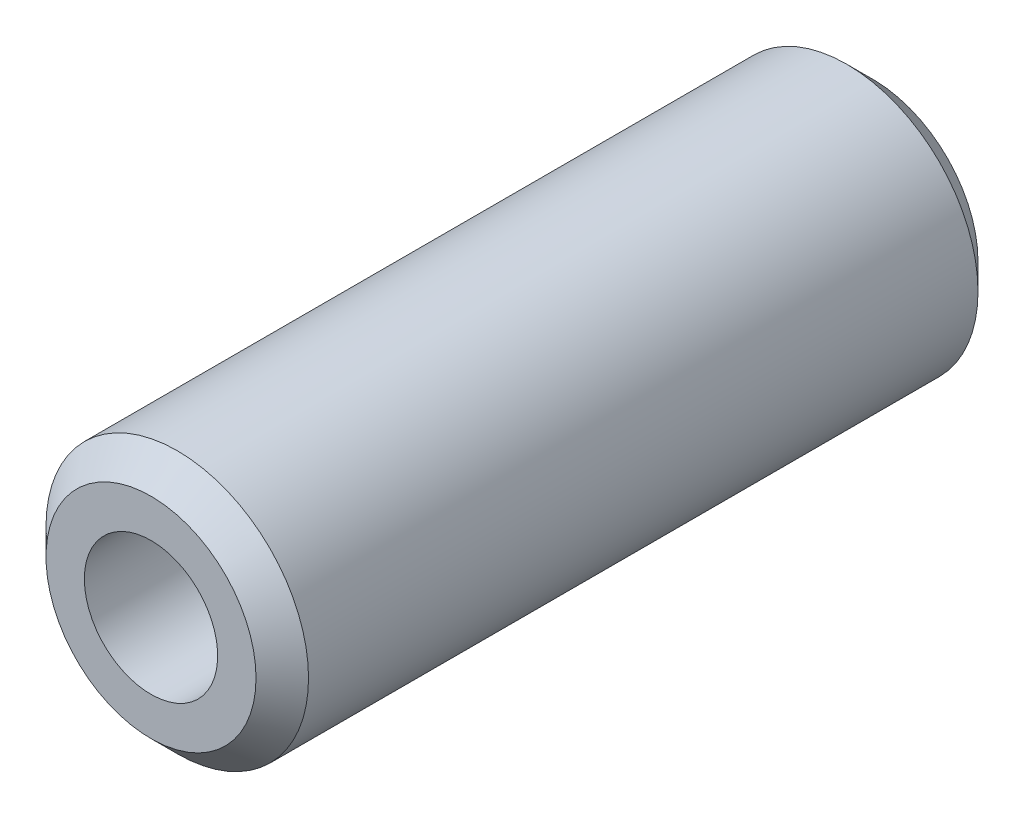
ISO-10303-21;
HEADER;
FILE_DESCRIPTION(('STEP AP214'),'2;1');
FILE_NAME('part.step','',(''),(''),'','','');
FILE_SCHEMA(('AUTOMOTIVE_DESIGN { 1 0 10303 214 1 1 1 1 }'));
ENDSEC;
DATA;
#1=APPLICATION_CONTEXT('core data for automotive mechanical design processes');
#2=APPLICATION_PROTOCOL_DEFINITION('international standard','automotive_design',2000,#1);
#3=PRODUCT_CONTEXT('',#1,'mechanical');
#4=PRODUCT('Part','Part','',(#3));
#5=PRODUCT_RELATED_PRODUCT_CATEGORY('part','',(#4));
#6=PRODUCT_DEFINITION_FORMATION('','',#4);
#7=PRODUCT_DEFINITION_CONTEXT('part definition',#1,'design');
#8=PRODUCT_DEFINITION('design','',#6,#7);
#9=PRODUCT_DEFINITION_SHAPE('','',#8);
#10=(LENGTH_UNIT() NAMED_UNIT(*) SI_UNIT(.MILLI.,.METRE.));
#11=(NAMED_UNIT(*) PLANE_ANGLE_UNIT() SI_UNIT($,.RADIAN.));
#12=(NAMED_UNIT(*) SI_UNIT($,.STERADIAN.) SOLID_ANGLE_UNIT());
#13=UNCERTAINTY_MEASURE_WITH_UNIT(LENGTH_MEASURE(1.E-05),#10,'distance_accuracy_value','');
#14=(GEOMETRIC_REPRESENTATION_CONTEXT(3) GLOBAL_UNCERTAINTY_ASSIGNED_CONTEXT((#13)) GLOBAL_UNIT_ASSIGNED_CONTEXT((#10,
#11,#12)) REPRESENTATION_CONTEXT('',''));
#15=CARTESIAN_POINT('',(0.,0.,0.));
#16=DIRECTION('',(0.,0.,1.));
#17=DIRECTION('',(1.,0.,0.));
#18=AXIS2_PLACEMENT_3D('',#15,#16,#17);
#19=CARTESIAN_POINT('',(0.,0.,69.85));
#20=DIRECTION('',(0.,0.,-1.));
#21=DIRECTION('',(-1.,0.,0.));
#22=AXIS2_PLACEMENT_3D('',#19,#20,#21);
#23=CYLINDRICAL_SURFACE('',#22,12.7);
#24=CARTESIAN_POINT('',(0.,0.,67.31));
#25=DIRECTION('',(0.,0.,1.));
#26=DIRECTION('',(1.,0.,0.));
#27=AXIS2_PLACEMENT_3D('',#24,#25,#26);
#28=CIRCLE('',#27,12.7);
#29=CARTESIAN_POINT('',(12.7,0.,67.31));
#30=VERTEX_POINT('',#29);
#31=EDGE_CURVE('E51',#30,#30,#28,.F.);
#32=ORIENTED_EDGE('',*,*,#31,.T.);
#33=EDGE_LOOP('',(#32));
#34=FACE_BOUND('',#33,.T.);
#35=CARTESIAN_POINT('',(0.,0.,2.54000000000001));
#36=DIRECTION('',(0.,0.,1.));
#37=DIRECTION('',(1.,0.,0.));
#38=AXIS2_PLACEMENT_3D('',#35,#36,#37);
#39=CIRCLE('',#38,12.7);
#40=CARTESIAN_POINT('',(12.7,0.,2.54000000000001));
#41=VERTEX_POINT('',#40);
#42=EDGE_CURVE('E56',#41,#41,#39,.T.);
#43=ORIENTED_EDGE('',*,*,#42,.T.);
#44=EDGE_LOOP('',(#43));
#45=FACE_BOUND('',#44,.T.);
#46=ADVANCED_FACE('F42',(#34,#45),#23,.T.);
#47=CARTESIAN_POINT('',(0.,0.,69.85));
#48=DIRECTION('',(0.,0.,1.));
#49=DIRECTION('',(1.,0.,0.));
#50=AXIS2_PLACEMENT_3D('',#47,#48,#49);
#51=PLANE('',#50);
#52=CARTESIAN_POINT('',(0.,0.,69.85));
#53=DIRECTION('',(0.,0.,1.));
#54=DIRECTION('',(1.,0.,0.));
#55=AXIS2_PLACEMENT_3D('',#52,#53,#54);
#56=CIRCLE('',#55,10.16);
#57=CARTESIAN_POINT('',(10.16,0.,69.85));
#58=VERTEX_POINT('',#57);
#59=EDGE_CURVE('E61',#58,#58,#56,.T.);
#60=ORIENTED_EDGE('',*,*,#59,.T.);
#61=EDGE_LOOP('',(#60));
#62=FACE_BOUND('',#61,.T.);
#63=CARTESIAN_POINT('',(0.,0.,69.85));
#64=DIRECTION('',(0.,0.,-1.));
#65=DIRECTION('',(-1.,0.,0.));
#66=AXIS2_PLACEMENT_3D('',#63,#64,#65);
#67=CIRCLE('',#66,6.45);
#68=CARTESIAN_POINT('',(-6.45,0.,69.85));
#69=VERTEX_POINT('',#68);
#70=EDGE_CURVE('E67',#69,#69,#67,.T.);
#71=ORIENTED_EDGE('',*,*,#70,.T.);
#72=EDGE_LOOP('',(#71));
#73=FACE_BOUND('',#72,.T.);
#74=ADVANCED_FACE('F76',(#62,#73),#51,.T.);
#75=CARTESIAN_POINT('',(0.,0.,0.));
#76=DIRECTION('',(0.,0.,1.));
#77=DIRECTION('',(1.,0.,0.));
#78=AXIS2_PLACEMENT_3D('',#75,#76,#77);
#79=PLANE('',#78);
#80=CARTESIAN_POINT('',(0.,0.,0.));
#81=DIRECTION('',(0.,0.,1.));
#82=DIRECTION('',(1.,0.,0.));
#83=AXIS2_PLACEMENT_3D('',#80,#81,#82);
#84=CIRCLE('',#83,10.16);
#85=CARTESIAN_POINT('',(10.16,0.,0.));
#86=VERTEX_POINT('',#85);
#87=EDGE_CURVE('E10',#86,#86,#84,.F.);
#88=ORIENTED_EDGE('',*,*,#87,.T.);
#89=EDGE_LOOP('',(#88));
#90=FACE_BOUND('',#89,.T.);
#91=CARTESIAN_POINT('',(0.,0.,0.));
#92=DIRECTION('',(0.,0.,-1.));
#93=DIRECTION('',(-1.,0.,0.));
#94=AXIS2_PLACEMENT_3D('',#91,#92,#93);
#95=CIRCLE('',#94,6.45);
#96=CARTESIAN_POINT('',(-6.45,0.,0.));
#97=VERTEX_POINT('',#96);
#98=EDGE_CURVE('E68',#97,#97,#95,.T.);
#99=ORIENTED_EDGE('',*,*,#98,.F.);
#100=EDGE_LOOP('',(#99));
#101=FACE_BOUND('',#100,.T.);
#102=ADVANCED_FACE('F82',(#90,#101),#79,.F.);
#103=CARTESIAN_POINT('',(0.,0.,69.85));
#104=DIRECTION('',(0.,0.,-1.));
#105=DIRECTION('',(-1.,0.,0.));
#106=AXIS2_PLACEMENT_3D('',#103,#104,#105);
#107=CYLINDRICAL_SURFACE('',#106,6.45);
#108=ORIENTED_EDGE('',*,*,#70,.F.);
#109=EDGE_LOOP('',(#108));
#110=FACE_BOUND('',#109,.T.);
#111=ORIENTED_EDGE('',*,*,#98,.T.);
#112=EDGE_LOOP('',(#111));
#113=FACE_BOUND('',#112,.T.);
#114=ADVANCED_FACE('F78',(#110,#113),#107,.F.);
#115=CARTESIAN_POINT('',(0.,0.,69.85));
#116=DIRECTION('',(0.,0.,-1.));
#117=DIRECTION('',(-1.,0.,0.));
#118=AXIS2_PLACEMENT_3D('',#115,#116,#117);
#119=CONICAL_SURFACE('',#118,10.16,0.785398163397445);
#120=ORIENTED_EDGE('',*,*,#31,.F.);
#121=EDGE_LOOP('',(#120));
#122=FACE_BOUND('',#121,.T.);
#123=ORIENTED_EDGE('',*,*,#59,.F.);
#124=EDGE_LOOP('',(#123));
#125=FACE_BOUND('',#124,.T.);
#126=ADVANCED_FACE('F81',(#122,#125),#119,.T.);
#127=CARTESIAN_POINT('',(0.,0.,2.54000000000001));
#128=DIRECTION('',(0.,0.,1.));
#129=DIRECTION('',(1.,0.,0.));
#130=AXIS2_PLACEMENT_3D('',#127,#128,#129);
#131=CONICAL_SURFACE('',#130,12.7,0.785398163397449);
#132=ORIENTED_EDGE('',*,*,#87,.F.);
#133=EDGE_LOOP('',(#132));
#134=FACE_BOUND('',#133,.T.);
#135=ORIENTED_EDGE('',*,*,#42,.F.);
#136=EDGE_LOOP('',(#135));
#137=FACE_BOUND('',#136,.T.);
#138=ADVANCED_FACE('F45',(#134,#137),#131,.T.);
#139=CLOSED_SHELL('',(#46,#74,#102,#114,#126,#138));
#140=MANIFOLD_SOLID_BREP('B2',#139);
#141=ADVANCED_BREP_SHAPE_REPRESENTATION('',(#18,#140),#14);
#142=SHAPE_DEFINITION_REPRESENTATION(#9,#141);
ENDSEC;
END-ISO-10303-21;
